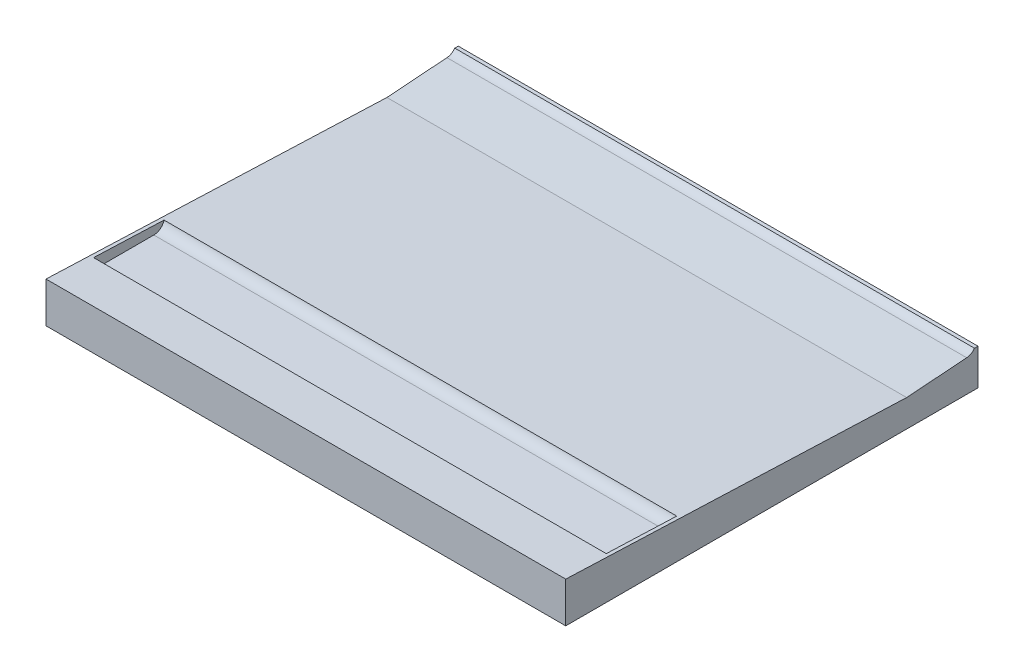
ISO-10303-21;
HEADER;
FILE_DESCRIPTION(('STEP AP214'),'2;1');
FILE_NAME('part.step','',(''),(''),'','','');
FILE_SCHEMA(('AUTOMOTIVE_DESIGN { 1 0 10303 214 1 1 1 1 }'));
ENDSEC;
DATA;
#1=APPLICATION_CONTEXT('core data for automotive mechanical design processes');
#2=APPLICATION_PROTOCOL_DEFINITION('international standard','automotive_design',2000,#1);
#3=PRODUCT_CONTEXT('',#1,'mechanical');
#4=PRODUCT('Part','Part','',(#3));
#5=PRODUCT_RELATED_PRODUCT_CATEGORY('part','',(#4));
#6=PRODUCT_DEFINITION_FORMATION('','',#4);
#7=PRODUCT_DEFINITION_CONTEXT('part definition',#1,'design');
#8=PRODUCT_DEFINITION('design','',#6,#7);
#9=PRODUCT_DEFINITION_SHAPE('','',#8);
#10=(LENGTH_UNIT() NAMED_UNIT(*) SI_UNIT(.MILLI.,.METRE.));
#11=(NAMED_UNIT(*) PLANE_ANGLE_UNIT() SI_UNIT($,.RADIAN.));
#12=(NAMED_UNIT(*) SI_UNIT($,.STERADIAN.) SOLID_ANGLE_UNIT());
#13=UNCERTAINTY_MEASURE_WITH_UNIT(LENGTH_MEASURE(1.E-05),#10,'distance_accuracy_value','');
#14=(GEOMETRIC_REPRESENTATION_CONTEXT(3) GLOBAL_UNCERTAINTY_ASSIGNED_CONTEXT((#13)) GLOBAL_UNIT_ASSIGNED_CONTEXT((#10,
#11,#12)) REPRESENTATION_CONTEXT('',''));
#15=CARTESIAN_POINT('',(0.,0.,0.));
#16=DIRECTION('',(0.,0.,1.));
#17=DIRECTION('',(1.,0.,0.));
#18=AXIS2_PLACEMENT_3D('',#15,#16,#17);
#19=CARTESIAN_POINT('',(-147.5,28.,-117.));
#20=DIRECTION('',(1.,0.,0.));
#21=DIRECTION('',(0.,0.,-1.));
#22=AXIS2_PLACEMENT_3D('',#19,#20,#21);
#23=PLANE('',#22);
#24=DIRECTION('',(0.,-1.,0.));
#25=VECTOR('',#24,1.);
#26=CARTESIAN_POINT('',(-147.5,28.,117.));
#27=LINE('',#26,#25);
#28=CARTESIAN_POINT('',(-147.5,28.,117.));
#29=VERTEX_POINT('',#28);
#30=CARTESIAN_POINT('',(-147.5,5.00000000000001,117.));
#31=VERTEX_POINT('',#30);
#32=EDGE_CURVE('E237',#29,#31,#27,.T.);
#33=ORIENTED_EDGE('',*,*,#32,.F.);
#34=DIRECTION('',(0.,0.0387306080819821,0.999249688515138));
#35=VECTOR('',#34,1.);
#36=CARTESIAN_POINT('',(-147.5,28.,117.));
#37=LINE('',#36,#35);
#38=CARTESIAN_POINT('',(-147.5,20.5,-76.5));
#39=VERTEX_POINT('',#38);
#40=EDGE_CURVE('E217',#39,#29,#37,.T.);
#41=ORIENTED_EDGE('',*,*,#40,.F.);
#42=DIRECTION('',(0.,-0.0738716855153118,0.997267754456709));
#43=VECTOR('',#42,1.);
#44=CARTESIAN_POINT('',(-147.5,20.5,-76.5));
#45=LINE('',#44,#43);
#46=CARTESIAN_POINT('',(-147.5,23.0241021048028,-110.575378414837));
#47=VERTEX_POINT('',#46);
#48=EDGE_CURVE('E213',#47,#39,#45,.T.);
#49=ORIENTED_EDGE('',*,*,#48,.F.);
#50=CARTESIAN_POINT('',(-147.5,29.007708631543,-110.132148301746));
#51=DIRECTION('',(1.,0.,0.));
#52=DIRECTION('',(0.,0.,-1.));
#53=AXIS2_PLACEMENT_3D('',#50,#51,#52);
#54=CIRCLE('',#53,6.);
#55=CARTESIAN_POINT('',(-147.5,25.5,-115.));
#56=VERTEX_POINT('',#55);
#57=EDGE_CURVE('E152',#47,#56,#54,.T.);
#58=ORIENTED_EDGE('',*,*,#57,.T.);
#59=DIRECTION('',(0.,0.,-1.));
#60=VECTOR('',#59,1.);
#61=CARTESIAN_POINT('',(-147.5,25.5,-117.));
#62=LINE('',#61,#60);
#63=CARTESIAN_POINT('',(-147.5,25.5,-117.));
#64=VERTEX_POINT('',#63);
#65=EDGE_CURVE('E133',#56,#64,#62,.T.);
#66=ORIENTED_EDGE('',*,*,#65,.T.);
#67=DIRECTION('',(0.,-1.,0.));
#68=VECTOR('',#67,1.);
#69=CARTESIAN_POINT('',(-147.5,28.,-117.));
#70=LINE('',#69,#68);
#71=CARTESIAN_POINT('',(-147.5,5.00000000000001,-117.));
#72=VERTEX_POINT('',#71);
#73=EDGE_CURVE('E176',#64,#72,#70,.T.);
#74=ORIENTED_EDGE('',*,*,#73,.T.);
#75=DIRECTION('',(0.,0.,1.));
#76=VECTOR('',#75,1.);
#77=CARTESIAN_POINT('',(-147.5,5.,-117.));
#78=LINE('',#77,#76);
#79=EDGE_CURVE('E182',#72,#31,#78,.T.);
#80=ORIENTED_EDGE('',*,*,#79,.T.);
#81=EDGE_LOOP('',(#33,#41,#49,#58,#66,#74,#80));
#82=FACE_BOUND('',#81,.T.);
#83=ADVANCED_FACE('F32',(#82),#23,.F.);
#84=CARTESIAN_POINT('',(-147.5,28.,117.));
#85=DIRECTION('',(0.,0.,-1.));
#86=DIRECTION('',(-1.,0.,0.));
#87=AXIS2_PLACEMENT_3D('',#84,#85,#86);
#88=PLANE('',#87);
#89=ORIENTED_EDGE('',*,*,#32,.T.);
#90=DIRECTION('',(1.,0.,0.));
#91=VECTOR('',#90,1.);
#92=CARTESIAN_POINT('',(-147.5,5.,117.));
#93=LINE('',#92,#91);
#94=CARTESIAN_POINT('',(147.5,5.00000000000001,117.));
#95=VERTEX_POINT('',#94);
#96=EDGE_CURVE('E189',#31,#95,#93,.T.);
#97=ORIENTED_EDGE('',*,*,#96,.T.);
#98=DIRECTION('',(0.,-1.,0.));
#99=VECTOR('',#98,1.);
#100=CARTESIAN_POINT('',(147.5,28.,117.));
#101=LINE('',#100,#99);
#102=CARTESIAN_POINT('',(147.5,28.,117.));
#103=VERTEX_POINT('',#102);
#104=EDGE_CURVE('E234',#103,#95,#101,.T.);
#105=ORIENTED_EDGE('',*,*,#104,.F.);
#106=DIRECTION('',(1.,0.,0.));
#107=VECTOR('',#106,1.);
#108=CARTESIAN_POINT('',(-147.5,28.,117.));
#109=LINE('',#108,#107);
#110=EDGE_CURVE('E184',#29,#103,#109,.T.);
#111=ORIENTED_EDGE('',*,*,#110,.F.);
#112=EDGE_LOOP('',(#89,#97,#105,#111));
#113=FACE_BOUND('',#112,.T.);
#114=ADVANCED_FACE('F249',(#113),#88,.F.);
#115=CARTESIAN_POINT('',(147.5,28.,-117.));
#116=DIRECTION('',(-1.,0.,0.));
#117=DIRECTION('',(0.,0.,1.));
#118=AXIS2_PLACEMENT_3D('',#115,#116,#117);
#119=PLANE('',#118);
#120=DIRECTION('',(0.,0.0387306080819821,0.999249688515138));
#121=VECTOR('',#120,1.);
#122=CARTESIAN_POINT('',(147.5,18.9438377535101,-116.648985959438));
#123=LINE('',#122,#121);
#124=CARTESIAN_POINT('',(147.5,20.5,-76.5));
#125=VERTEX_POINT('',#124);
#126=EDGE_CURVE('E228',#125,#103,#123,.T.);
#127=ORIENTED_EDGE('',*,*,#126,.T.);
#128=ORIENTED_EDGE('',*,*,#104,.T.);
#129=DIRECTION('',(0.,0.,-1.));
#130=VECTOR('',#129,1.);
#131=CARTESIAN_POINT('',(147.5,5.,-117.));
#132=LINE('',#131,#130);
#133=CARTESIAN_POINT('',(147.5,5.00000000000001,-117.));
#134=VERTEX_POINT('',#133);
#135=EDGE_CURVE('E239',#95,#134,#132,.T.);
#136=ORIENTED_EDGE('',*,*,#135,.T.);
#137=DIRECTION('',(0.,-1.,0.));
#138=VECTOR('',#137,1.);
#139=CARTESIAN_POINT('',(147.5,28.,-117.));
#140=LINE('',#139,#138);
#141=CARTESIAN_POINT('',(147.5,25.5,-117.));
#142=VERTEX_POINT('',#141);
#143=EDGE_CURVE('E144',#142,#134,#140,.T.);
#144=ORIENTED_EDGE('',*,*,#143,.F.);
#145=DIRECTION('',(0.,0.,-1.));
#146=VECTOR('',#145,1.);
#147=CARTESIAN_POINT('',(147.5,25.5,-117.));
#148=LINE('',#147,#146);
#149=CARTESIAN_POINT('',(147.5,25.5,-115.));
#150=VERTEX_POINT('',#149);
#151=EDGE_CURVE('E131',#150,#142,#148,.T.);
#152=ORIENTED_EDGE('',*,*,#151,.F.);
#153=CARTESIAN_POINT('',(147.5,29.007708631543,-110.132148301746));
#154=DIRECTION('',(-1.,0.,0.));
#155=DIRECTION('',(0.,0.,1.));
#156=AXIS2_PLACEMENT_3D('',#153,#154,#155);
#157=CIRCLE('',#156,6.);
#158=CARTESIAN_POINT('',(147.5,23.0241021048028,-110.575378414837));
#159=VERTEX_POINT('',#158);
#160=EDGE_CURVE('E140',#150,#159,#157,.T.);
#161=ORIENTED_EDGE('',*,*,#160,.T.);
#162=DIRECTION('',(0.,-0.0738716855153118,0.997267754456709));
#163=VECTOR('',#162,1.);
#164=CARTESIAN_POINT('',(147.5,23.5245566166439,-117.331514324693));
#165=LINE('',#164,#163);
#166=EDGE_CURVE('E215',#159,#125,#165,.T.);
#167=ORIENTED_EDGE('',*,*,#166,.T.);
#168=EDGE_LOOP('',(#127,#128,#136,#144,#152,#161,#167));
#169=FACE_BOUND('',#168,.T.);
#170=ADVANCED_FACE('F139',(#169),#119,.F.);
#171=CARTESIAN_POINT('',(-147.5,28.,-117.));
#172=DIRECTION('',(0.,0.,1.));
#173=DIRECTION('',(1.,0.,0.));
#174=AXIS2_PLACEMENT_3D('',#171,#172,#173);
#175=PLANE('',#174);
#176=ORIENTED_EDGE('',*,*,#143,.T.);
#177=DIRECTION('',(-1.,0.,0.));
#178=VECTOR('',#177,1.);
#179=CARTESIAN_POINT('',(-147.5,5.,-117.));
#180=LINE('',#179,#178);
#181=EDGE_CURVE('E169',#134,#72,#180,.T.);
#182=ORIENTED_EDGE('',*,*,#181,.T.);
#183=ORIENTED_EDGE('',*,*,#73,.F.);
#184=DIRECTION('',(-1.,0.,0.));
#185=VECTOR('',#184,1.);
#186=CARTESIAN_POINT('',(147.5,25.5,-117.));
#187=LINE('',#186,#185);
#188=EDGE_CURVE('E136',#142,#64,#187,.T.);
#189=ORIENTED_EDGE('',*,*,#188,.F.);
#190=EDGE_LOOP('',(#176,#182,#183,#189));
#191=FACE_BOUND('',#190,.T.);
#192=ADVANCED_FACE('F175',(#191),#175,.F.);
#193=CARTESIAN_POINT('',(-147.5,0.,117.));
#194=DIRECTION('',(0.,1.,0.));
#195=DIRECTION('',(0.,0.,1.));
#196=AXIS2_PLACEMENT_3D('',#193,#194,#195);
#197=PLANE('',#196);
#198=DIRECTION('',(0.,0.,-1.));
#199=VECTOR('',#198,1.);
#200=CARTESIAN_POINT('',(-142.5,0.,117.));
#201=LINE('',#200,#199);
#202=CARTESIAN_POINT('',(-142.5,0.,112.));
#203=VERTEX_POINT('',#202);
#204=CARTESIAN_POINT('',(-142.5,0.,-112.));
#205=VERTEX_POINT('',#204);
#206=EDGE_CURVE('E195',#203,#205,#201,.T.);
#207=ORIENTED_EDGE('',*,*,#206,.T.);
#208=DIRECTION('',(1.,0.,0.));
#209=VECTOR('',#208,1.);
#210=CARTESIAN_POINT('',(-147.5,0.,-112.));
#211=LINE('',#210,#209);
#212=CARTESIAN_POINT('',(142.5,0.,-112.));
#213=VERTEX_POINT('',#212);
#214=EDGE_CURVE('E40',#205,#213,#211,.T.);
#215=ORIENTED_EDGE('',*,*,#214,.T.);
#216=DIRECTION('',(0.,0.,1.));
#217=VECTOR('',#216,1.);
#218=CARTESIAN_POINT('',(142.5,0.,117.));
#219=LINE('',#218,#217);
#220=CARTESIAN_POINT('',(142.5,0.,112.));
#221=VERTEX_POINT('',#220);
#222=EDGE_CURVE('E190',#213,#221,#219,.T.);
#223=ORIENTED_EDGE('',*,*,#222,.T.);
#224=DIRECTION('',(-1.,0.,0.));
#225=VECTOR('',#224,1.);
#226=CARTESIAN_POINT('',(-147.5,0.,112.));
#227=LINE('',#226,#225);
#228=EDGE_CURVE('E201',#221,#203,#227,.T.);
#229=ORIENTED_EDGE('',*,*,#228,.T.);
#230=EDGE_LOOP('',(#207,#215,#223,#229));
#231=FACE_BOUND('',#230,.T.);
#232=ADVANCED_FACE('F240',(#231),#197,.F.);
#233=CARTESIAN_POINT('',(152.5,20.5,-76.5));
#234=DIRECTION('',(0.,-0.997267754456709,-0.0738716855153118));
#235=DIRECTION('',(0.,0.0738716855153118,-0.997267754456709));
#236=AXIS2_PLACEMENT_3D('',#233,#234,#235);
#237=PLANE('',#236);
#238=ORIENTED_EDGE('',*,*,#166,.F.);
#239=DIRECTION('',(-1.,0.,0.));
#240=VECTOR('',#239,1.);
#241=CARTESIAN_POINT('',(152.5,23.0241021048028,-110.575378414837));
#242=LINE('',#241,#240);
#243=EDGE_CURVE('E150',#159,#47,#242,.T.);
#244=ORIENTED_EDGE('',*,*,#243,.T.);
#245=ORIENTED_EDGE('',*,*,#48,.T.);
#246=DIRECTION('',(-1.,0.,0.));
#247=VECTOR('',#246,1.);
#248=CARTESIAN_POINT('',(152.5,20.5,-76.5));
#249=LINE('',#248,#247);
#250=EDGE_CURVE('E220',#125,#39,#249,.T.);
#251=ORIENTED_EDGE('',*,*,#250,.F.);
#252=EDGE_LOOP('',(#238,#244,#245,#251));
#253=FACE_BOUND('',#252,.T.);
#254=ADVANCED_FACE('F211',(#253),#237,.F.);
#255=CARTESIAN_POINT('',(152.5,28.,117.));
#256=DIRECTION('',(0.,-0.999249688515138,0.0387306080819821));
#257=DIRECTION('',(0.,-0.0387306080819821,-0.999249688515138));
#258=AXIS2_PLACEMENT_3D('',#255,#256,#257);
#259=PLANE('',#258);
#260=DIRECTION('',(0.,-0.0387306080819821,-0.999249688515138));
#261=VECTOR('',#260,1.);
#262=CARTESIAN_POINT('',(145.5,27.031007751938,92.));
#263=LINE('',#262,#261);
#264=CARTESIAN_POINT('',(145.5,27.031007751938,92.));
#265=VERTEX_POINT('',#264);
#266=CARTESIAN_POINT('',(145.5,25.4806201550388,52.));
#267=VERTEX_POINT('',#266);
#268=EDGE_CURVE('E437',#265,#267,#263,.T.);
#269=ORIENTED_EDGE('',*,*,#268,.F.);
#270=DIRECTION('',(-1.,0.,0.));
#271=VECTOR('',#270,1.);
#272=CARTESIAN_POINT('',(152.5,27.031007751938,92.));
#273=LINE('',#272,#271);
#274=CARTESIAN_POINT('',(-145.5,27.031007751938,92.));
#275=VERTEX_POINT('',#274);
#276=EDGE_CURVE('E207',#265,#275,#273,.T.);
#277=ORIENTED_EDGE('',*,*,#276,.T.);
#278=DIRECTION('',(0.,-0.0387306080819821,-0.999249688515138));
#279=VECTOR('',#278,1.);
#280=CARTESIAN_POINT('',(-145.5,27.031007751938,92.));
#281=LINE('',#280,#279);
#282=CARTESIAN_POINT('',(-145.5,25.4806201550388,52.));
#283=VERTEX_POINT('',#282);
#284=EDGE_CURVE('E223',#275,#283,#281,.T.);
#285=ORIENTED_EDGE('',*,*,#284,.T.);
#286=DIRECTION('',(1.,0.,0.));
#287=VECTOR('',#286,1.);
#288=CARTESIAN_POINT('',(152.5,25.4806201550388,52.));
#289=LINE('',#288,#287);
#290=EDGE_CURVE('E204',#283,#267,#289,.T.);
#291=ORIENTED_EDGE('',*,*,#290,.T.);
#292=EDGE_LOOP('',(#269,#277,#285,#291));
#293=FACE_BOUND('',#292,.T.);
#294=ORIENTED_EDGE('',*,*,#40,.T.);
#295=ORIENTED_EDGE('',*,*,#110,.T.);
#296=ORIENTED_EDGE('',*,*,#126,.F.);
#297=ORIENTED_EDGE('',*,*,#250,.T.);
#298=EDGE_LOOP('',(#294,#295,#296,#297));
#299=FACE_BOUND('',#298,.T.);
#300=ADVANCED_FACE('F274',(#293,#299),#259,.F.);
#301=CARTESIAN_POINT('',(147.5,5.,-117.));
#302=DIRECTION('',(-0.707106781186547,0.707106781186547,0.));
#303=DIRECTION('',(-0.707106781186548,-0.707106781186548,0.));
#304=AXIS2_PLACEMENT_3D('',#301,#302,#303);
#305=PLANE('',#304);
#306=ORIENTED_EDGE('',*,*,#222,.F.);
#307=DIRECTION('',(0.577350269189626,0.577350269189626,-0.577350269189626));
#308=VECTOR('',#307,1.);
#309=CARTESIAN_POINT('',(147.5,5.,-117.));
#310=LINE('',#309,#308);
#311=EDGE_CURVE('E11',#213,#134,#310,.T.);
#312=ORIENTED_EDGE('',*,*,#311,.T.);
#313=ORIENTED_EDGE('',*,*,#135,.F.);
#314=DIRECTION('',(-0.577350269189626,-0.577350269189626,-0.577350269189626));
#315=VECTOR('',#314,1.);
#316=CARTESIAN_POINT('',(69.5,-73.,39.));
#317=LINE('',#316,#315);
#318=EDGE_CURVE('E193',#95,#221,#317,.T.);
#319=ORIENTED_EDGE('',*,*,#318,.T.);
#320=EDGE_LOOP('',(#306,#312,#313,#319));
#321=FACE_BOUND('',#320,.T.);
#322=ADVANCED_FACE('F244',(#321),#305,.F.);
#323=CARTESIAN_POINT('',(-147.5,5.,-117.));
#324=DIRECTION('',(0.707106781186547,0.707106781186547,0.));
#325=DIRECTION('',(-0.707106781186548,0.707106781186548,0.));
#326=AXIS2_PLACEMENT_3D('',#323,#324,#325);
#327=PLANE('',#326);
#328=ORIENTED_EDGE('',*,*,#79,.F.);
#329=DIRECTION('',(0.577350269189626,-0.577350269189626,0.577350269189626));
#330=VECTOR('',#329,1.);
#331=CARTESIAN_POINT('',(-147.5,5.,-117.));
#332=LINE('',#331,#330);
#333=EDGE_CURVE('E54',#72,#205,#332,.T.);
#334=ORIENTED_EDGE('',*,*,#333,.T.);
#335=ORIENTED_EDGE('',*,*,#206,.F.);
#336=DIRECTION('',(-0.577350269189626,0.577350269189626,0.577350269189626));
#337=VECTOR('',#336,1.);
#338=CARTESIAN_POINT('',(-69.5,-73.,39.));
#339=LINE('',#338,#337);
#340=EDGE_CURVE('E188',#203,#31,#339,.T.);
#341=ORIENTED_EDGE('',*,*,#340,.T.);
#342=EDGE_LOOP('',(#328,#334,#335,#341));
#343=FACE_BOUND('',#342,.T.);
#344=ADVANCED_FACE('F186',(#343),#327,.F.);
#345=CARTESIAN_POINT('',(-147.5,5.,117.));
#346=DIRECTION('',(0.,0.707106781186547,-0.707106781186547));
#347=DIRECTION('',(0.,0.707106781186548,0.707106781186548));
#348=AXIS2_PLACEMENT_3D('',#345,#346,#347);
#349=PLANE('',#348);
#350=ORIENTED_EDGE('',*,*,#340,.F.);
#351=ORIENTED_EDGE('',*,*,#228,.F.);
#352=ORIENTED_EDGE('',*,*,#318,.F.);
#353=ORIENTED_EDGE('',*,*,#96,.F.);
#354=EDGE_LOOP('',(#350,#351,#352,#353));
#355=FACE_BOUND('',#354,.T.);
#356=ADVANCED_FACE('F252',(#355),#349,.F.);
#357=CARTESIAN_POINT('',(152.5,21.031007751938,92.));
#358=DIRECTION('',(0.,-1.,0.));
#359=DIRECTION('',(0.,0.,-1.));
#360=AXIS2_PLACEMENT_3D('',#357,#358,#359);
#361=PLANE('',#360);
#362=DIRECTION('',(0.,0.,1.));
#363=VECTOR('',#362,1.);
#364=CARTESIAN_POINT('',(-145.5,21.031007751938,52.));
#365=LINE('',#364,#363);
#366=CARTESIAN_POINT('',(-145.5,21.031007751938,57.7962313876674));
#367=VERTEX_POINT('',#366);
#368=CARTESIAN_POINT('',(-145.5,21.031007751938,86.));
#369=VERTEX_POINT('',#368);
#370=EDGE_CURVE('E218',#367,#369,#365,.T.);
#371=ORIENTED_EDGE('',*,*,#370,.T.);
#372=DIRECTION('',(-1.,0.,0.));
#373=VECTOR('',#372,1.);
#374=CARTESIAN_POINT('',(145.5,21.031007751938,86.));
#375=LINE('',#374,#373);
#376=CARTESIAN_POINT('',(145.5,21.031007751938,86.));
#377=VERTEX_POINT('',#376);
#378=EDGE_CURVE('E163',#369,#377,#375,.F.);
#379=ORIENTED_EDGE('',*,*,#378,.T.);
#380=DIRECTION('',(0.,0.,1.));
#381=VECTOR('',#380,1.);
#382=CARTESIAN_POINT('',(145.5,21.031007751938,52.));
#383=LINE('',#382,#381);
#384=CARTESIAN_POINT('',(145.5,21.031007751938,57.7962313876674));
#385=VERTEX_POINT('',#384);
#386=EDGE_CURVE('E435',#385,#377,#383,.T.);
#387=ORIENTED_EDGE('',*,*,#386,.F.);
#388=DIRECTION('',(-1.,0.,0.));
#389=VECTOR('',#388,1.);
#390=CARTESIAN_POINT('',(152.5,21.031007751938,57.7962313876674));
#391=LINE('',#390,#389);
#392=EDGE_CURVE('E160',#385,#367,#391,.T.);
#393=ORIENTED_EDGE('',*,*,#392,.T.);
#394=EDGE_LOOP('',(#371,#379,#387,#393));
#395=FACE_BOUND('',#394,.T.);
#396=ADVANCED_FACE('F254',(#395),#361,.F.);
#397=CARTESIAN_POINT('',(-145.5,21.031007751938,92.));
#398=DIRECTION('',(1.,0.,0.));
#399=DIRECTION('',(0.,0.,-1.));
#400=AXIS2_PLACEMENT_3D('',#397,#398,#399);
#401=PLANE('',#400);
#402=ORIENTED_EDGE('',*,*,#284,.F.);
#403=CARTESIAN_POINT('',(-145.5,27.031007751938,86.));
#404=DIRECTION('',(1.,0.,0.));
#405=DIRECTION('',(0.,0.,-1.));
#406=AXIS2_PLACEMENT_3D('',#403,#404,#405);
#407=CIRCLE('',#406,6.);
#408=EDGE_CURVE('E154',#275,#369,#407,.T.);
#409=ORIENTED_EDGE('',*,*,#408,.T.);
#410=ORIENTED_EDGE('',*,*,#370,.F.);
#411=CARTESIAN_POINT('',(-145.5,27.031007751938,57.7962313876674));
#412=DIRECTION('',(1.,0.,0.));
#413=DIRECTION('',(0.,0.,-1.));
#414=AXIS2_PLACEMENT_3D('',#411,#412,#413);
#415=CIRCLE('',#414,6.);
#416=EDGE_CURVE('E151',#367,#283,#415,.T.);
#417=ORIENTED_EDGE('',*,*,#416,.T.);
#418=EDGE_LOOP('',(#402,#409,#410,#417));
#419=FACE_BOUND('',#418,.T.);
#420=ADVANCED_FACE('F260',(#419),#401,.T.);
#421=CARTESIAN_POINT('',(145.5,21.031007751938,92.));
#422=DIRECTION('',(-1.,0.,0.));
#423=DIRECTION('',(0.,0.,-1.));
#424=AXIS2_PLACEMENT_3D('',#421,#422,#423);
#425=PLANE('',#424);
#426=ORIENTED_EDGE('',*,*,#386,.T.);
#427=CARTESIAN_POINT('',(145.5,27.031007751938,86.));
#428=DIRECTION('',(-1.,0.,0.));
#429=DIRECTION('',(0.,0.,1.));
#430=AXIS2_PLACEMENT_3D('',#427,#428,#429);
#431=CIRCLE('',#430,6.);
#432=EDGE_CURVE('E167',#377,#265,#431,.T.);
#433=ORIENTED_EDGE('',*,*,#432,.T.);
#434=ORIENTED_EDGE('',*,*,#268,.T.);
#435=CARTESIAN_POINT('',(145.5,27.031007751938,57.7962313876674));
#436=DIRECTION('',(-1.,0.,0.));
#437=DIRECTION('',(0.,0.,1.));
#438=AXIS2_PLACEMENT_3D('',#435,#436,#437);
#439=CIRCLE('',#438,6.);
#440=EDGE_CURVE('E165',#267,#385,#439,.T.);
#441=ORIENTED_EDGE('',*,*,#440,.T.);
#442=EDGE_LOOP('',(#426,#433,#434,#441));
#443=FACE_BOUND('',#442,.T.);
#444=ADVANCED_FACE('F320',(#443),#425,.T.);
#445=CARTESIAN_POINT('',(147.5,25.5,-117.));
#446=DIRECTION('',(0.,1.,0.));
#447=DIRECTION('',(0.,0.,1.));
#448=AXIS2_PLACEMENT_3D('',#445,#446,#447);
#449=PLANE('',#448);
#450=ORIENTED_EDGE('',*,*,#65,.F.);
#451=DIRECTION('',(-1.,0.,0.));
#452=VECTOR('',#451,1.);
#453=CARTESIAN_POINT('',(147.5,25.5,-115.));
#454=LINE('',#453,#452);
#455=EDGE_CURVE('E127',#150,#56,#454,.T.);
#456=ORIENTED_EDGE('',*,*,#455,.F.);
#457=ORIENTED_EDGE('',*,*,#151,.T.);
#458=ORIENTED_EDGE('',*,*,#188,.T.);
#459=EDGE_LOOP('',(#450,#456,#457,#458));
#460=FACE_BOUND('',#459,.T.);
#461=ADVANCED_FACE('F129',(#460),#449,.T.);
#462=CARTESIAN_POINT('',(147.5,29.007708631543,-110.132148301746));
#463=DIRECTION('',(-1.,0.,0.));
#464=DIRECTION('',(0.,0.,1.));
#465=AXIS2_PLACEMENT_3D('',#462,#463,#464);
#466=CYLINDRICAL_SURFACE('',#465,6.);
#467=ORIENTED_EDGE('',*,*,#160,.F.);
#468=ORIENTED_EDGE('',*,*,#455,.T.);
#469=ORIENTED_EDGE('',*,*,#57,.F.);
#470=ORIENTED_EDGE('',*,*,#243,.F.);
#471=EDGE_LOOP('',(#467,#468,#469,#470));
#472=FACE_BOUND('',#471,.T.);
#473=ADVANCED_FACE('F148',(#472),#466,.F.);
#474=CARTESIAN_POINT('',(152.5,27.031007751938,86.));
#475=DIRECTION('',(1.,0.,0.));
#476=DIRECTION('',(0.,0.,-1.));
#477=AXIS2_PLACEMENT_3D('',#474,#475,#476);
#478=CYLINDRICAL_SURFACE('',#477,6.);
#479=ORIENTED_EDGE('',*,*,#432,.F.);
#480=ORIENTED_EDGE('',*,*,#378,.F.);
#481=ORIENTED_EDGE('',*,*,#408,.F.);
#482=ORIENTED_EDGE('',*,*,#276,.F.);
#483=EDGE_LOOP('',(#479,#480,#481,#482));
#484=FACE_BOUND('',#483,.T.);
#485=ADVANCED_FACE('F329',(#484),#478,.F.);
#486=CARTESIAN_POINT('',(152.5,27.031007751938,57.7962313876674));
#487=DIRECTION('',(-1.,0.,0.));
#488=DIRECTION('',(0.,0.,1.));
#489=AXIS2_PLACEMENT_3D('',#486,#487,#488);
#490=CYLINDRICAL_SURFACE('',#489,6.);
#491=ORIENTED_EDGE('',*,*,#440,.F.);
#492=ORIENTED_EDGE('',*,*,#290,.F.);
#493=ORIENTED_EDGE('',*,*,#416,.F.);
#494=ORIENTED_EDGE('',*,*,#392,.F.);
#495=EDGE_LOOP('',(#491,#492,#493,#494));
#496=FACE_BOUND('',#495,.T.);
#497=ADVANCED_FACE('F368',(#496),#490,.F.);
#498=CARTESIAN_POINT('',(-147.5,5.,-117.));
#499=DIRECTION('',(0.,0.707106781186547,0.707106781186547));
#500=DIRECTION('',(0.,-0.707106781186548,0.707106781186548));
#501=AXIS2_PLACEMENT_3D('',#498,#499,#500);
#502=PLANE('',#501);
#503=ORIENTED_EDGE('',*,*,#311,.F.);
#504=ORIENTED_EDGE('',*,*,#214,.F.);
#505=ORIENTED_EDGE('',*,*,#333,.F.);
#506=ORIENTED_EDGE('',*,*,#181,.F.);
#507=EDGE_LOOP('',(#503,#504,#505,#506));
#508=FACE_BOUND('',#507,.T.);
#509=ADVANCED_FACE('F34',(#508),#502,.F.);
#510=CLOSED_SHELL('',(#83,#114,#170,#192,#232,#254,#300,#322,#344,#356,#396,#420,#444,#461,#473,
#485,#497,#509));
#511=MANIFOLD_SOLID_BREP('B2',#510);
#512=ADVANCED_BREP_SHAPE_REPRESENTATION('',(#18,#511),#14);
#513=SHAPE_DEFINITION_REPRESENTATION(#9,#512);
ENDSEC;
END-ISO-10303-21;
